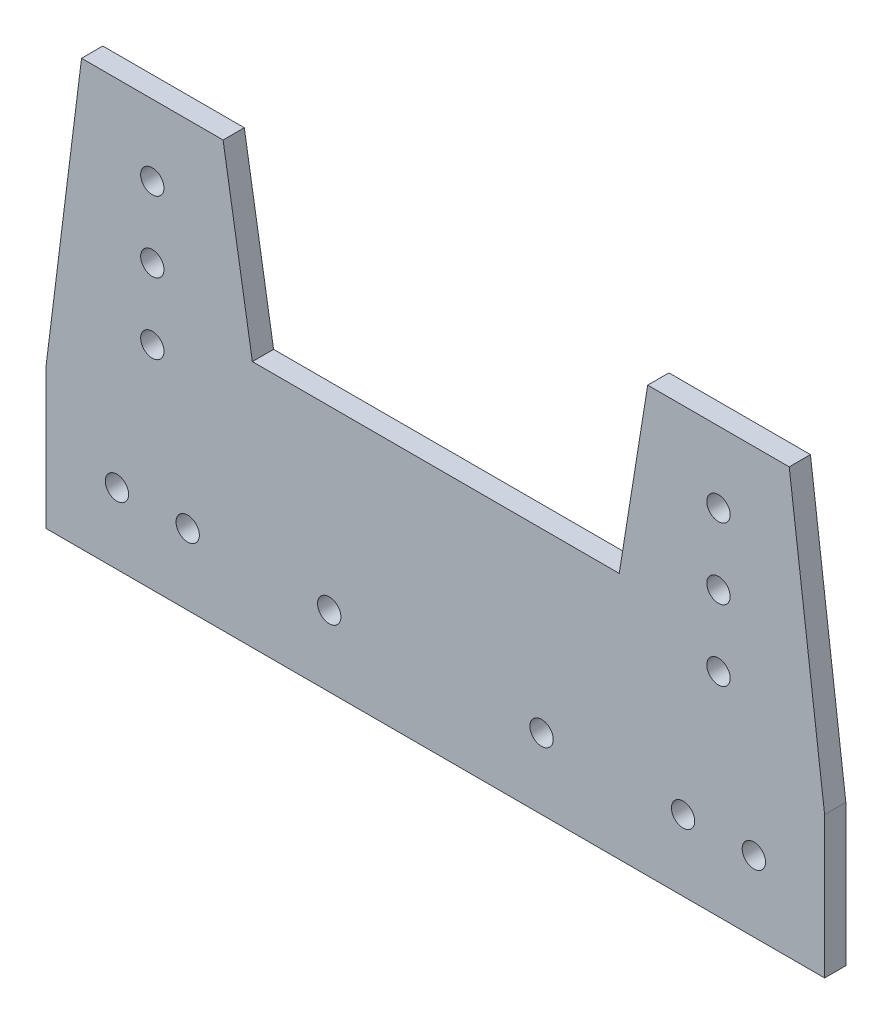
ISO-10303-21;
HEADER;
FILE_DESCRIPTION(('STEP AP214'),'2;1');
FILE_NAME('part.step','',(''),(''),'','','');
FILE_SCHEMA(('AUTOMOTIVE_DESIGN { 1 0 10303 214 1 1 1 1 }'));
ENDSEC;
DATA;
#1=APPLICATION_CONTEXT('core data for automotive mechanical design processes');
#2=APPLICATION_PROTOCOL_DEFINITION('international standard','automotive_design',2000,#1);
#3=PRODUCT_CONTEXT('',#1,'mechanical');
#4=PRODUCT('Part','Part','',(#3));
#5=PRODUCT_RELATED_PRODUCT_CATEGORY('part','',(#4));
#6=PRODUCT_DEFINITION_FORMATION('','',#4);
#7=PRODUCT_DEFINITION_CONTEXT('part definition',#1,'design');
#8=PRODUCT_DEFINITION('design','',#6,#7);
#9=PRODUCT_DEFINITION_SHAPE('','',#8);
#10=(LENGTH_UNIT() NAMED_UNIT(*) SI_UNIT(.MILLI.,.METRE.));
#11=(NAMED_UNIT(*) PLANE_ANGLE_UNIT() SI_UNIT($,.RADIAN.));
#12=(NAMED_UNIT(*) SI_UNIT($,.STERADIAN.) SOLID_ANGLE_UNIT());
#13=UNCERTAINTY_MEASURE_WITH_UNIT(LENGTH_MEASURE(1.E-05),#10,'distance_accuracy_value','');
#14=(GEOMETRIC_REPRESENTATION_CONTEXT(3) GLOBAL_UNCERTAINTY_ASSIGNED_CONTEXT((#13)) GLOBAL_UNIT_ASSIGNED_CONTEXT((#10,
#11,#12)) REPRESENTATION_CONTEXT('',''));
#15=CARTESIAN_POINT('',(0.,0.,0.));
#16=DIRECTION('',(0.,0.,1.));
#17=DIRECTION('',(1.,0.,0.));
#18=AXIS2_PLACEMENT_3D('',#15,#16,#17);
#19=CARTESIAN_POINT('',(0.,0.,3.));
#20=DIRECTION('',(0.,0.,1.));
#21=DIRECTION('',(1.,0.,0.));
#22=AXIS2_PLACEMENT_3D('',#19,#20,#21);
#23=PLANE('',#22);
#24=CARTESIAN_POINT('',(-40.,40.,3.));
#25=DIRECTION('',(0.,0.,1.));
#26=DIRECTION('',(1.,0.,0.));
#27=AXIS2_PLACEMENT_3D('',#24,#25,#26);
#28=CIRCLE('',#27,1.65);
#29=CARTESIAN_POINT('',(-38.35,40.,3.));
#30=VERTEX_POINT('',#29);
#31=EDGE_CURVE('E274',#30,#30,#28,.T.);
#32=ORIENTED_EDGE('',*,*,#31,.F.);
#33=EDGE_LOOP('',(#32));
#34=FACE_BOUND('',#33,.T.);
#35=CARTESIAN_POINT('',(-35.,0.,3.));
#36=DIRECTION('',(0.,0.,1.));
#37=DIRECTION('',(1.,0.,0.));
#38=AXIS2_PLACEMENT_3D('',#35,#36,#37);
#39=CIRCLE('',#38,1.65);
#40=CARTESIAN_POINT('',(-33.35,0.,3.));
#41=VERTEX_POINT('',#40);
#42=EDGE_CURVE('E262',#41,#41,#39,.T.);
#43=ORIENTED_EDGE('',*,*,#42,.F.);
#44=EDGE_LOOP('',(#43));
#45=FACE_BOUND('',#44,.T.);
#46=CARTESIAN_POINT('',(40.,20.,3.));
#47=DIRECTION('',(0.,0.,1.));
#48=DIRECTION('',(1.,0.,0.));
#49=AXIS2_PLACEMENT_3D('',#46,#47,#48);
#50=CIRCLE('',#49,1.65);
#51=CARTESIAN_POINT('',(41.65,20.,3.));
#52=VERTEX_POINT('',#51);
#53=EDGE_CURVE('E250',#52,#52,#50,.T.);
#54=ORIENTED_EDGE('',*,*,#53,.F.);
#55=EDGE_LOOP('',(#54));
#56=FACE_BOUND('',#55,.T.);
#57=CARTESIAN_POINT('',(-15.,0.,3.));
#58=DIRECTION('',(0.,0.,1.));
#59=DIRECTION('',(1.,0.,0.));
#60=AXIS2_PLACEMENT_3D('',#57,#58,#59);
#61=CIRCLE('',#60,1.65);
#62=CARTESIAN_POINT('',(-13.35,0.,3.));
#63=VERTEX_POINT('',#62);
#64=EDGE_CURVE('E238',#63,#63,#61,.T.);
#65=ORIENTED_EDGE('',*,*,#64,.F.);
#66=EDGE_LOOP('',(#65));
#67=FACE_BOUND('',#66,.T.);
#68=CARTESIAN_POINT('',(-40.,20.,3.));
#69=DIRECTION('',(0.,0.,1.));
#70=DIRECTION('',(1.,0.,0.));
#71=AXIS2_PLACEMENT_3D('',#68,#69,#70);
#72=CIRCLE('',#71,1.65);
#73=CARTESIAN_POINT('',(-38.35,20.,3.));
#74=VERTEX_POINT('',#73);
#75=EDGE_CURVE('E226',#74,#74,#72,.T.);
#76=ORIENTED_EDGE('',*,*,#75,.F.);
#77=EDGE_LOOP('',(#76));
#78=FACE_BOUND('',#77,.T.);
#79=CARTESIAN_POINT('',(45.,0.,3.));
#80=DIRECTION('',(0.,0.,1.));
#81=DIRECTION('',(1.,0.,0.));
#82=AXIS2_PLACEMENT_3D('',#79,#80,#81);
#83=CIRCLE('',#82,1.65);
#84=CARTESIAN_POINT('',(46.65,0.,3.));
#85=VERTEX_POINT('',#84);
#86=EDGE_CURVE('E154',#85,#85,#83,.T.);
#87=ORIENTED_EDGE('',*,*,#86,.F.);
#88=EDGE_LOOP('',(#87));
#89=FACE_BOUND('',#88,.T.);
#90=DIRECTION('',(0.,1.,0.));
#91=VECTOR('',#90,1.);
#92=CARTESIAN_POINT('',(55.,10.,3.));
#93=LINE('',#92,#91);
#94=CARTESIAN_POINT('',(55.0000000000004,-9.99999999999993,3.));
#95=VERTEX_POINT('',#94);
#96=CARTESIAN_POINT('',(55.,10.,3.));
#97=VERTEX_POINT('',#96);
#98=EDGE_CURVE('E169',#95,#97,#93,.T.);
#99=ORIENTED_EDGE('',*,*,#98,.T.);
#100=DIRECTION('',(-0.123873909162727,0.992297966655553,0.));
#101=VECTOR('',#100,1.);
#102=CARTESIAN_POINT('',(50.,50.0527428803437,3.));
#103=LINE('',#102,#101);
#104=CARTESIAN_POINT('',(50.,50.0527428803437,3.));
#105=VERTEX_POINT('',#104);
#106=EDGE_CURVE('E107',#97,#105,#103,.T.);
#107=ORIENTED_EDGE('',*,*,#106,.T.);
#108=DIRECTION('',(-1.,0.,0.));
#109=VECTOR('',#108,1.);
#110=CARTESIAN_POINT('',(30.,50.0527428803437,3.));
#111=LINE('',#110,#109);
#112=CARTESIAN_POINT('',(30.,50.0527428803437,3.));
#113=VERTEX_POINT('',#112);
#114=EDGE_CURVE('E190',#105,#113,#111,.T.);
#115=ORIENTED_EDGE('',*,*,#114,.T.);
#116=DIRECTION('',(-0.158461282121987,-0.987365191845579,0.));
#117=VECTOR('',#116,1.);
#118=CARTESIAN_POINT('',(30.,50.0527428803437,3.));
#119=LINE('',#118,#117);
#120=CARTESIAN_POINT('',(25.9793095905364,25.,3.));
#121=VERTEX_POINT('',#120);
#122=EDGE_CURVE('E209',#113,#121,#119,.T.);
#123=ORIENTED_EDGE('',*,*,#122,.T.);
#124=DIRECTION('',(-1.,0.,0.));
#125=VECTOR('',#124,1.);
#126=CARTESIAN_POINT('',(-25.8642326267696,25.,3.));
#127=LINE('',#126,#125);
#128=CARTESIAN_POINT('',(-25.8642326267696,25.,3.));
#129=VERTEX_POINT('',#128);
#130=EDGE_CURVE('E206',#121,#129,#127,.T.);
#131=ORIENTED_EDGE('',*,*,#130,.T.);
#132=DIRECTION('',(-0.162877944725253,0.986646225919948,0.));
#133=VECTOR('',#132,1.);
#134=CARTESIAN_POINT('',(-30.,50.0527428803437,3.));
#135=LINE('',#134,#133);
#136=CARTESIAN_POINT('',(-30.,50.0527428803437,3.));
#137=VERTEX_POINT('',#136);
#138=EDGE_CURVE('E208',#129,#137,#135,.T.);
#139=ORIENTED_EDGE('',*,*,#138,.T.);
#140=DIRECTION('',(-1.,0.,0.));
#141=VECTOR('',#140,1.);
#142=CARTESIAN_POINT('',(-50.,50.0527428803437,3.));
#143=LINE('',#142,#141);
#144=CARTESIAN_POINT('',(-50.,50.0527428803437,3.));
#145=VERTEX_POINT('',#144);
#146=EDGE_CURVE('E132',#137,#145,#143,.T.);
#147=ORIENTED_EDGE('',*,*,#146,.T.);
#148=DIRECTION('',(-0.123873909162727,-0.992297966655553,0.));
#149=VECTOR('',#148,1.);
#150=CARTESIAN_POINT('',(-50.,50.0527428803437,3.));
#151=LINE('',#150,#149);
#152=CARTESIAN_POINT('',(-55.,10.,3.));
#153=VERTEX_POINT('',#152);
#154=EDGE_CURVE('E126',#145,#153,#151,.T.);
#155=ORIENTED_EDGE('',*,*,#154,.T.);
#156=DIRECTION('',(0.,-1.,0.));
#157=VECTOR('',#156,1.);
#158=CARTESIAN_POINT('',(-55.,10.,3.));
#159=LINE('',#158,#157);
#160=CARTESIAN_POINT('',(-55.0000000000001,-10.,3.));
#161=VERTEX_POINT('',#160);
#162=EDGE_CURVE('E130',#153,#161,#159,.T.);
#163=ORIENTED_EDGE('',*,*,#162,.T.);
#164=DIRECTION('',(1.,0.,0.));
#165=VECTOR('',#164,1.);
#166=CARTESIAN_POINT('',(-55.0000000000001,-10.,3.));
#167=LINE('',#166,#165);
#168=EDGE_CURVE('E58',#161,#95,#167,.T.);
#169=ORIENTED_EDGE('',*,*,#168,.T.);
#170=EDGE_LOOP('',(#99,#107,#115,#123,#131,#139,#147,#155,#163,#169));
#171=FACE_BOUND('',#170,.T.);
#172=CARTESIAN_POINT('',(-45.,0.,3.));
#173=DIRECTION('',(0.,0.,1.));
#174=DIRECTION('',(1.,0.,0.));
#175=AXIS2_PLACEMENT_3D('',#172,#173,#174);
#176=CIRCLE('',#175,1.65);
#177=CARTESIAN_POINT('',(-43.35,0.,3.));
#178=VERTEX_POINT('',#177);
#179=EDGE_CURVE('E220',#178,#178,#176,.T.);
#180=ORIENTED_EDGE('',*,*,#179,.F.);
#181=EDGE_LOOP('',(#180));
#182=FACE_BOUND('',#181,.T.);
#183=CARTESIAN_POINT('',(15.,0.,3.));
#184=DIRECTION('',(0.,0.,1.));
#185=DIRECTION('',(1.,0.,0.));
#186=AXIS2_PLACEMENT_3D('',#183,#184,#185);
#187=CIRCLE('',#186,1.65);
#188=CARTESIAN_POINT('',(16.65,0.,3.));
#189=VERTEX_POINT('',#188);
#190=EDGE_CURVE('E232',#189,#189,#187,.T.);
#191=ORIENTED_EDGE('',*,*,#190,.F.);
#192=EDGE_LOOP('',(#191));
#193=FACE_BOUND('',#192,.T.);
#194=CARTESIAN_POINT('',(-40.,30.,3.));
#195=DIRECTION('',(0.,0.,1.));
#196=DIRECTION('',(1.,0.,0.));
#197=AXIS2_PLACEMENT_3D('',#194,#195,#196);
#198=CIRCLE('',#197,1.65);
#199=CARTESIAN_POINT('',(-38.35,30.,3.));
#200=VERTEX_POINT('',#199);
#201=EDGE_CURVE('E244',#200,#200,#198,.T.);
#202=ORIENTED_EDGE('',*,*,#201,.F.);
#203=EDGE_LOOP('',(#202));
#204=FACE_BOUND('',#203,.T.);
#205=CARTESIAN_POINT('',(35.,0.,3.));
#206=DIRECTION('',(0.,0.,1.));
#207=DIRECTION('',(1.,0.,0.));
#208=AXIS2_PLACEMENT_3D('',#205,#206,#207);
#209=CIRCLE('',#208,1.65);
#210=CARTESIAN_POINT('',(36.65,0.,3.));
#211=VERTEX_POINT('',#210);
#212=EDGE_CURVE('E256',#211,#211,#209,.T.);
#213=ORIENTED_EDGE('',*,*,#212,.F.);
#214=EDGE_LOOP('',(#213));
#215=FACE_BOUND('',#214,.T.);
#216=CARTESIAN_POINT('',(40.,30.,3.));
#217=DIRECTION('',(0.,0.,1.));
#218=DIRECTION('',(1.,0.,0.));
#219=AXIS2_PLACEMENT_3D('',#216,#217,#218);
#220=CIRCLE('',#219,1.65);
#221=CARTESIAN_POINT('',(41.65,30.,3.));
#222=VERTEX_POINT('',#221);
#223=EDGE_CURVE('E268',#222,#222,#220,.T.);
#224=ORIENTED_EDGE('',*,*,#223,.F.);
#225=EDGE_LOOP('',(#224));
#226=FACE_BOUND('',#225,.T.);
#227=CARTESIAN_POINT('',(40.,40.,3.));
#228=DIRECTION('',(0.,0.,1.));
#229=DIRECTION('',(1.,0.,0.));
#230=AXIS2_PLACEMENT_3D('',#227,#228,#229);
#231=CIRCLE('',#230,1.65);
#232=CARTESIAN_POINT('',(41.65,40.,3.));
#233=VERTEX_POINT('',#232);
#234=EDGE_CURVE('E280',#233,#233,#231,.T.);
#235=ORIENTED_EDGE('',*,*,#234,.F.);
#236=EDGE_LOOP('',(#235));
#237=FACE_BOUND('',#236,.T.);
#238=ADVANCED_FACE('F41',(#34,#45,#56,#67,#78,#89,#171,#182,#193,#204,#215,#226,#237),#23,.T.);
#239=CARTESIAN_POINT('',(0.,0.,0.));
#240=DIRECTION('',(0.,0.,1.));
#241=DIRECTION('',(1.,0.,0.));
#242=AXIS2_PLACEMENT_3D('',#239,#240,#241);
#243=PLANE('',#242);
#244=DIRECTION('',(0.,1.,0.));
#245=VECTOR('',#244,1.);
#246=CARTESIAN_POINT('',(55.,10.,0.));
#247=LINE('',#246,#245);
#248=CARTESIAN_POINT('',(55.0000000000004,-9.99999999999993,0.));
#249=VERTEX_POINT('',#248);
#250=CARTESIAN_POINT('',(55.,10.,0.));
#251=VERTEX_POINT('',#250);
#252=EDGE_CURVE('E150',#249,#251,#247,.T.);
#253=ORIENTED_EDGE('',*,*,#252,.F.);
#254=DIRECTION('',(1.,0.,0.));
#255=VECTOR('',#254,1.);
#256=CARTESIAN_POINT('',(-55.0000000000001,-10.,0.));
#257=LINE('',#256,#255);
#258=CARTESIAN_POINT('',(-55.0000000000001,-10.,0.));
#259=VERTEX_POINT('',#258);
#260=EDGE_CURVE('E99',#259,#249,#257,.T.);
#261=ORIENTED_EDGE('',*,*,#260,.F.);
#262=DIRECTION('',(0.,-1.,0.));
#263=VECTOR('',#262,1.);
#264=CARTESIAN_POINT('',(-55.,10.,0.));
#265=LINE('',#264,#263);
#266=CARTESIAN_POINT('',(-55.,10.,0.));
#267=VERTEX_POINT('',#266);
#268=EDGE_CURVE('E93',#267,#259,#265,.T.);
#269=ORIENTED_EDGE('',*,*,#268,.F.);
#270=DIRECTION('',(-0.123873909162727,-0.992297966655553,0.));
#271=VECTOR('',#270,1.);
#272=CARTESIAN_POINT('',(-50.,50.0527428803437,0.));
#273=LINE('',#272,#271);
#274=CARTESIAN_POINT('',(-50.,50.0527428803437,0.));
#275=VERTEX_POINT('',#274);
#276=EDGE_CURVE('E140',#275,#267,#273,.T.);
#277=ORIENTED_EDGE('',*,*,#276,.F.);
#278=DIRECTION('',(-1.,0.,0.));
#279=VECTOR('',#278,1.);
#280=CARTESIAN_POINT('',(-50.,50.0527428803437,0.));
#281=LINE('',#280,#279);
#282=CARTESIAN_POINT('',(-30.,50.0527428803437,0.));
#283=VERTEX_POINT('',#282);
#284=EDGE_CURVE('E164',#283,#275,#281,.T.);
#285=ORIENTED_EDGE('',*,*,#284,.F.);
#286=DIRECTION('',(-0.162877944725253,0.986646225919948,0.));
#287=VECTOR('',#286,1.);
#288=CARTESIAN_POINT('',(-30.,50.0527428803437,0.));
#289=LINE('',#288,#287);
#290=CARTESIAN_POINT('',(-25.8642326267696,25.,0.));
#291=VERTEX_POINT('',#290);
#292=EDGE_CURVE('E162',#291,#283,#289,.T.);
#293=ORIENTED_EDGE('',*,*,#292,.F.);
#294=DIRECTION('',(-1.,0.,0.));
#295=VECTOR('',#294,1.);
#296=CARTESIAN_POINT('',(-25.8642326267696,25.,0.));
#297=LINE('',#296,#295);
#298=CARTESIAN_POINT('',(25.9793095905364,25.,0.));
#299=VERTEX_POINT('',#298);
#300=EDGE_CURVE('E160',#299,#291,#297,.T.);
#301=ORIENTED_EDGE('',*,*,#300,.F.);
#302=DIRECTION('',(-0.158461282121987,-0.987365191845579,0.));
#303=VECTOR('',#302,1.);
#304=CARTESIAN_POINT('',(30.,50.0527428803437,0.));
#305=LINE('',#304,#303);
#306=CARTESIAN_POINT('',(30.,50.0527428803437,0.));
#307=VERTEX_POINT('',#306);
#308=EDGE_CURVE('E158',#307,#299,#305,.T.);
#309=ORIENTED_EDGE('',*,*,#308,.F.);
#310=DIRECTION('',(-1.,0.,0.));
#311=VECTOR('',#310,1.);
#312=CARTESIAN_POINT('',(30.,50.0527428803437,0.));
#313=LINE('',#312,#311);
#314=CARTESIAN_POINT('',(50.,50.0527428803437,0.));
#315=VERTEX_POINT('',#314);
#316=EDGE_CURVE('E156',#315,#307,#313,.T.);
#317=ORIENTED_EDGE('',*,*,#316,.F.);
#318=DIRECTION('',(-0.123873909162727,0.992297966655553,0.));
#319=VECTOR('',#318,1.);
#320=CARTESIAN_POINT('',(50.,50.0527428803437,0.));
#321=LINE('',#320,#319);
#322=EDGE_CURVE('E153',#251,#315,#321,.T.);
#323=ORIENTED_EDGE('',*,*,#322,.F.);
#324=EDGE_LOOP('',(#253,#261,#269,#277,#285,#293,#301,#309,#317,#323));
#325=FACE_BOUND('',#324,.T.);
#326=CARTESIAN_POINT('',(45.,0.,0.));
#327=DIRECTION('',(0.,0.,1.));
#328=DIRECTION('',(1.,0.,0.));
#329=AXIS2_PLACEMENT_3D('',#326,#327,#328);
#330=CIRCLE('',#329,1.65);
#331=CARTESIAN_POINT('',(46.65,0.,0.));
#332=VERTEX_POINT('',#331);
#333=EDGE_CURVE('E217',#332,#332,#330,.T.);
#334=ORIENTED_EDGE('',*,*,#333,.T.);
#335=EDGE_LOOP('',(#334));
#336=FACE_BOUND('',#335,.T.);
#337=CARTESIAN_POINT('',(-45.,0.,0.));
#338=DIRECTION('',(0.,0.,1.));
#339=DIRECTION('',(1.,0.,0.));
#340=AXIS2_PLACEMENT_3D('',#337,#338,#339);
#341=CIRCLE('',#340,1.65);
#342=CARTESIAN_POINT('',(-43.35,0.,0.));
#343=VERTEX_POINT('',#342);
#344=EDGE_CURVE('E223',#343,#343,#341,.T.);
#345=ORIENTED_EDGE('',*,*,#344,.T.);
#346=EDGE_LOOP('',(#345));
#347=FACE_BOUND('',#346,.T.);
#348=CARTESIAN_POINT('',(-40.,20.,0.));
#349=DIRECTION('',(0.,0.,1.));
#350=DIRECTION('',(1.,0.,0.));
#351=AXIS2_PLACEMENT_3D('',#348,#349,#350);
#352=CIRCLE('',#351,1.65);
#353=CARTESIAN_POINT('',(-38.35,20.,0.));
#354=VERTEX_POINT('',#353);
#355=EDGE_CURVE('E229',#354,#354,#352,.T.);
#356=ORIENTED_EDGE('',*,*,#355,.T.);
#357=EDGE_LOOP('',(#356));
#358=FACE_BOUND('',#357,.T.);
#359=CARTESIAN_POINT('',(15.,0.,0.));
#360=DIRECTION('',(0.,0.,1.));
#361=DIRECTION('',(1.,0.,0.));
#362=AXIS2_PLACEMENT_3D('',#359,#360,#361);
#363=CIRCLE('',#362,1.65);
#364=CARTESIAN_POINT('',(16.65,0.,0.));
#365=VERTEX_POINT('',#364);
#366=EDGE_CURVE('E235',#365,#365,#363,.T.);
#367=ORIENTED_EDGE('',*,*,#366,.T.);
#368=EDGE_LOOP('',(#367));
#369=FACE_BOUND('',#368,.T.);
#370=CARTESIAN_POINT('',(-15.,0.,0.));
#371=DIRECTION('',(0.,0.,1.));
#372=DIRECTION('',(1.,0.,0.));
#373=AXIS2_PLACEMENT_3D('',#370,#371,#372);
#374=CIRCLE('',#373,1.65);
#375=CARTESIAN_POINT('',(-13.35,0.,0.));
#376=VERTEX_POINT('',#375);
#377=EDGE_CURVE('E241',#376,#376,#374,.T.);
#378=ORIENTED_EDGE('',*,*,#377,.T.);
#379=EDGE_LOOP('',(#378));
#380=FACE_BOUND('',#379,.T.);
#381=CARTESIAN_POINT('',(-40.,30.,0.));
#382=DIRECTION('',(0.,0.,1.));
#383=DIRECTION('',(1.,0.,0.));
#384=AXIS2_PLACEMENT_3D('',#381,#382,#383);
#385=CIRCLE('',#384,1.65);
#386=CARTESIAN_POINT('',(-38.35,30.,0.));
#387=VERTEX_POINT('',#386);
#388=EDGE_CURVE('E247',#387,#387,#385,.T.);
#389=ORIENTED_EDGE('',*,*,#388,.T.);
#390=EDGE_LOOP('',(#389));
#391=FACE_BOUND('',#390,.T.);
#392=CARTESIAN_POINT('',(40.,20.,0.));
#393=DIRECTION('',(0.,0.,1.));
#394=DIRECTION('',(1.,0.,0.));
#395=AXIS2_PLACEMENT_3D('',#392,#393,#394);
#396=CIRCLE('',#395,1.65);
#397=CARTESIAN_POINT('',(41.65,20.,0.));
#398=VERTEX_POINT('',#397);
#399=EDGE_CURVE('E253',#398,#398,#396,.T.);
#400=ORIENTED_EDGE('',*,*,#399,.T.);
#401=EDGE_LOOP('',(#400));
#402=FACE_BOUND('',#401,.T.);
#403=CARTESIAN_POINT('',(35.,0.,0.));
#404=DIRECTION('',(0.,0.,1.));
#405=DIRECTION('',(1.,0.,0.));
#406=AXIS2_PLACEMENT_3D('',#403,#404,#405);
#407=CIRCLE('',#406,1.65);
#408=CARTESIAN_POINT('',(36.65,0.,0.));
#409=VERTEX_POINT('',#408);
#410=EDGE_CURVE('E259',#409,#409,#407,.T.);
#411=ORIENTED_EDGE('',*,*,#410,.T.);
#412=EDGE_LOOP('',(#411));
#413=FACE_BOUND('',#412,.T.);
#414=CARTESIAN_POINT('',(-35.,0.,0.));
#415=DIRECTION('',(0.,0.,1.));
#416=DIRECTION('',(1.,0.,0.));
#417=AXIS2_PLACEMENT_3D('',#414,#415,#416);
#418=CIRCLE('',#417,1.65);
#419=CARTESIAN_POINT('',(-33.35,0.,0.));
#420=VERTEX_POINT('',#419);
#421=EDGE_CURVE('E265',#420,#420,#418,.T.);
#422=ORIENTED_EDGE('',*,*,#421,.T.);
#423=EDGE_LOOP('',(#422));
#424=FACE_BOUND('',#423,.T.);
#425=CARTESIAN_POINT('',(40.,30.,0.));
#426=DIRECTION('',(0.,0.,1.));
#427=DIRECTION('',(1.,0.,0.));
#428=AXIS2_PLACEMENT_3D('',#425,#426,#427);
#429=CIRCLE('',#428,1.65);
#430=CARTESIAN_POINT('',(41.65,30.,0.));
#431=VERTEX_POINT('',#430);
#432=EDGE_CURVE('E271',#431,#431,#429,.T.);
#433=ORIENTED_EDGE('',*,*,#432,.T.);
#434=EDGE_LOOP('',(#433));
#435=FACE_BOUND('',#434,.T.);
#436=CARTESIAN_POINT('',(-40.,40.,0.));
#437=DIRECTION('',(0.,0.,1.));
#438=DIRECTION('',(1.,0.,0.));
#439=AXIS2_PLACEMENT_3D('',#436,#437,#438);
#440=CIRCLE('',#439,1.65);
#441=CARTESIAN_POINT('',(-38.35,40.,0.));
#442=VERTEX_POINT('',#441);
#443=EDGE_CURVE('E277',#442,#442,#440,.T.);
#444=ORIENTED_EDGE('',*,*,#443,.T.);
#445=EDGE_LOOP('',(#444));
#446=FACE_BOUND('',#445,.T.);
#447=CARTESIAN_POINT('',(40.,40.,0.));
#448=DIRECTION('',(0.,0.,1.));
#449=DIRECTION('',(1.,0.,0.));
#450=AXIS2_PLACEMENT_3D('',#447,#448,#449);
#451=CIRCLE('',#450,1.65);
#452=CARTESIAN_POINT('',(41.65,40.,0.));
#453=VERTEX_POINT('',#452);
#454=EDGE_CURVE('E283',#453,#453,#451,.T.);
#455=ORIENTED_EDGE('',*,*,#454,.T.);
#456=EDGE_LOOP('',(#455));
#457=FACE_BOUND('',#456,.T.);
#458=ADVANCED_FACE('F194',(#325,#336,#347,#358,#369,#380,#391,#402,#413,#424,#435,#446,#457),
#243,.F.);
#459=CARTESIAN_POINT('',(55.,10.,3.));
#460=DIRECTION('',(-1.,0.,0.));
#461=DIRECTION('',(0.,-1.,0.));
#462=AXIS2_PLACEMENT_3D('',#459,#460,#461);
#463=PLANE('',#462);
#464=ORIENTED_EDGE('',*,*,#252,.T.);
#465=DIRECTION('',(0.,0.,-1.));
#466=VECTOR('',#465,1.);
#467=CARTESIAN_POINT('',(55.,10.,3.));
#468=LINE('',#467,#466);
#469=EDGE_CURVE('E11',#97,#251,#468,.T.);
#470=ORIENTED_EDGE('',*,*,#469,.F.);
#471=ORIENTED_EDGE('',*,*,#98,.F.);
#472=DIRECTION('',(0.,0.,-1.));
#473=VECTOR('',#472,1.);
#474=CARTESIAN_POINT('',(55.0000000000004,-9.99999999999993,3.));
#475=LINE('',#474,#473);
#476=EDGE_CURVE('E146',#95,#249,#475,.T.);
#477=ORIENTED_EDGE('',*,*,#476,.T.);
#478=EDGE_LOOP('',(#464,#470,#471,#477));
#479=FACE_BOUND('',#478,.T.);
#480=ADVANCED_FACE('F43',(#479),#463,.F.);
#481=CARTESIAN_POINT('',(50.,50.0527428803437,3.));
#482=DIRECTION('',(-0.992297966655553,-0.123873909162727,0.));
#483=DIRECTION('',(0.123873909162727,-0.992297966655553,0.));
#484=AXIS2_PLACEMENT_3D('',#481,#482,#483);
#485=PLANE('',#484);
#486=ORIENTED_EDGE('',*,*,#322,.T.);
#487=DIRECTION('',(0.,0.,-1.));
#488=VECTOR('',#487,1.);
#489=CARTESIAN_POINT('',(50.,50.0527428803437,3.));
#490=LINE('',#489,#488);
#491=EDGE_CURVE('E50',#105,#315,#490,.T.);
#492=ORIENTED_EDGE('',*,*,#491,.F.);
#493=ORIENTED_EDGE('',*,*,#106,.F.);
#494=ORIENTED_EDGE('',*,*,#469,.T.);
#495=EDGE_LOOP('',(#486,#492,#493,#494));
#496=FACE_BOUND('',#495,.T.);
#497=ADVANCED_FACE('F325',(#496),#485,.F.);
#498=CARTESIAN_POINT('',(30.,50.0527428803437,3.));
#499=DIRECTION('',(0.,-1.,0.));
#500=DIRECTION('',(1.,0.,0.));
#501=AXIS2_PLACEMENT_3D('',#498,#499,#500);
#502=PLANE('',#501);
#503=ORIENTED_EDGE('',*,*,#316,.T.);
#504=DIRECTION('',(0.,0.,-1.));
#505=VECTOR('',#504,1.);
#506=CARTESIAN_POINT('',(30.,50.0527428803437,3.));
#507=LINE('',#506,#505);
#508=EDGE_CURVE('E182',#113,#307,#507,.T.);
#509=ORIENTED_EDGE('',*,*,#508,.F.);
#510=ORIENTED_EDGE('',*,*,#114,.F.);
#511=ORIENTED_EDGE('',*,*,#491,.T.);
#512=EDGE_LOOP('',(#503,#509,#510,#511));
#513=FACE_BOUND('',#512,.T.);
#514=ADVANCED_FACE('F188',(#513),#502,.F.);
#515=CARTESIAN_POINT('',(30.,50.0527428803437,3.));
#516=DIRECTION('',(0.987365191845578,-0.158461282121987,0.));
#517=DIRECTION('',(0.158461282121987,0.987365191845579,0.));
#518=AXIS2_PLACEMENT_3D('',#515,#516,#517);
#519=PLANE('',#518);
#520=ORIENTED_EDGE('',*,*,#308,.T.);
#521=DIRECTION('',(0.,0.,-1.));
#522=VECTOR('',#521,1.);
#523=CARTESIAN_POINT('',(25.9793095905364,25.,3.));
#524=LINE('',#523,#522);
#525=EDGE_CURVE('E179',#121,#299,#524,.T.);
#526=ORIENTED_EDGE('',*,*,#525,.F.);
#527=ORIENTED_EDGE('',*,*,#122,.F.);
#528=ORIENTED_EDGE('',*,*,#508,.T.);
#529=EDGE_LOOP('',(#520,#526,#527,#528));
#530=FACE_BOUND('',#529,.T.);
#531=ADVANCED_FACE('F200',(#530),#519,.F.);
#532=CARTESIAN_POINT('',(-25.8642326267696,25.,3.));
#533=DIRECTION('',(0.,-1.,0.));
#534=DIRECTION('',(0.,0.,-1.));
#535=AXIS2_PLACEMENT_3D('',#532,#533,#534);
#536=PLANE('',#535);
#537=ORIENTED_EDGE('',*,*,#300,.T.);
#538=DIRECTION('',(0.,0.,-1.));
#539=VECTOR('',#538,1.);
#540=CARTESIAN_POINT('',(-25.8642326267696,25.,3.));
#541=LINE('',#540,#539);
#542=EDGE_CURVE('E176',#129,#291,#541,.T.);
#543=ORIENTED_EDGE('',*,*,#542,.F.);
#544=ORIENTED_EDGE('',*,*,#130,.F.);
#545=ORIENTED_EDGE('',*,*,#525,.T.);
#546=EDGE_LOOP('',(#537,#543,#544,#545));
#547=FACE_BOUND('',#546,.T.);
#548=ADVANCED_FACE('F204',(#547),#536,.F.);
#549=CARTESIAN_POINT('',(-30.,50.0527428803437,3.));
#550=DIRECTION('',(-0.986646225919948,-0.162877944725253,0.));
#551=DIRECTION('',(0.162877944725253,-0.986646225919948,0.));
#552=AXIS2_PLACEMENT_3D('',#549,#550,#551);
#553=PLANE('',#552);
#554=ORIENTED_EDGE('',*,*,#292,.T.);
#555=DIRECTION('',(0.,0.,-1.));
#556=VECTOR('',#555,1.);
#557=CARTESIAN_POINT('',(-30.,50.0527428803437,3.));
#558=LINE('',#557,#556);
#559=EDGE_CURVE('E173',#137,#283,#558,.T.);
#560=ORIENTED_EDGE('',*,*,#559,.F.);
#561=ORIENTED_EDGE('',*,*,#138,.F.);
#562=ORIENTED_EDGE('',*,*,#542,.T.);
#563=EDGE_LOOP('',(#554,#560,#561,#562));
#564=FACE_BOUND('',#563,.T.);
#565=ADVANCED_FACE('F315',(#564),#553,.F.);
#566=CARTESIAN_POINT('',(-50.,50.0527428803437,3.));
#567=DIRECTION('',(0.,-1.,0.));
#568=DIRECTION('',(1.,0.,0.));
#569=AXIS2_PLACEMENT_3D('',#566,#567,#568);
#570=PLANE('',#569);
#571=ORIENTED_EDGE('',*,*,#284,.T.);
#572=DIRECTION('',(0.,0.,-1.));
#573=VECTOR('',#572,1.);
#574=CARTESIAN_POINT('',(-50.,50.0527428803437,3.));
#575=LINE('',#574,#573);
#576=EDGE_CURVE('E141',#145,#275,#575,.T.);
#577=ORIENTED_EDGE('',*,*,#576,.F.);
#578=ORIENTED_EDGE('',*,*,#146,.F.);
#579=ORIENTED_EDGE('',*,*,#559,.T.);
#580=EDGE_LOOP('',(#571,#577,#578,#579));
#581=FACE_BOUND('',#580,.T.);
#582=ADVANCED_FACE('F312',(#581),#570,.F.);
#583=CARTESIAN_POINT('',(-50.,50.0527428803437,3.));
#584=DIRECTION('',(0.992297966655553,-0.123873909162727,0.));
#585=DIRECTION('',(0.123873909162727,0.992297966655553,0.));
#586=AXIS2_PLACEMENT_3D('',#583,#584,#585);
#587=PLANE('',#586);
#588=ORIENTED_EDGE('',*,*,#276,.T.);
#589=DIRECTION('',(0.,0.,-1.));
#590=VECTOR('',#589,1.);
#591=CARTESIAN_POINT('',(-55.,10.,3.));
#592=LINE('',#591,#590);
#593=EDGE_CURVE('E137',#153,#267,#592,.T.);
#594=ORIENTED_EDGE('',*,*,#593,.F.);
#595=ORIENTED_EDGE('',*,*,#154,.F.);
#596=ORIENTED_EDGE('',*,*,#576,.T.);
#597=EDGE_LOOP('',(#588,#594,#595,#596));
#598=FACE_BOUND('',#597,.T.);
#599=ADVANCED_FACE('F138',(#598),#587,.F.);
#600=CARTESIAN_POINT('',(-55.,10.,3.));
#601=DIRECTION('',(1.,0.,0.));
#602=DIRECTION('',(0.,1.,0.));
#603=AXIS2_PLACEMENT_3D('',#600,#601,#602);
#604=PLANE('',#603);
#605=ORIENTED_EDGE('',*,*,#268,.T.);
#606=DIRECTION('',(0.,0.,-1.));
#607=VECTOR('',#606,1.);
#608=CARTESIAN_POINT('',(-55.0000000000001,-10.,3.));
#609=LINE('',#608,#607);
#610=EDGE_CURVE('E142',#161,#259,#609,.T.);
#611=ORIENTED_EDGE('',*,*,#610,.F.);
#612=ORIENTED_EDGE('',*,*,#162,.F.);
#613=ORIENTED_EDGE('',*,*,#593,.T.);
#614=EDGE_LOOP('',(#605,#611,#612,#613));
#615=FACE_BOUND('',#614,.T.);
#616=ADVANCED_FACE('F144',(#615),#604,.F.);
#617=CARTESIAN_POINT('',(-55.0000000000001,-10.,3.));
#618=DIRECTION('',(0.,1.,0.));
#619=DIRECTION('',(-1.,0.,0.));
#620=AXIS2_PLACEMENT_3D('',#617,#618,#619);
#621=PLANE('',#620);
#622=ORIENTED_EDGE('',*,*,#260,.T.);
#623=ORIENTED_EDGE('',*,*,#476,.F.);
#624=ORIENTED_EDGE('',*,*,#168,.F.);
#625=ORIENTED_EDGE('',*,*,#610,.T.);
#626=EDGE_LOOP('',(#622,#623,#624,#625));
#627=FACE_BOUND('',#626,.T.);
#628=ADVANCED_FACE('F305',(#627),#621,.F.);
#629=CARTESIAN_POINT('',(45.,0.,3.));
#630=DIRECTION('',(0.,0.,-1.));
#631=DIRECTION('',(-1.,0.,0.));
#632=AXIS2_PLACEMENT_3D('',#629,#630,#631);
#633=CYLINDRICAL_SURFACE('',#632,1.65);
#634=ORIENTED_EDGE('',*,*,#86,.T.);
#635=EDGE_LOOP('',(#634));
#636=FACE_BOUND('',#635,.T.);
#637=ORIENTED_EDGE('',*,*,#333,.F.);
#638=EDGE_LOOP('',(#637));
#639=FACE_BOUND('',#638,.T.);
#640=ADVANCED_FACE('F302',(#636,#639),#633,.F.);
#641=CARTESIAN_POINT('',(-45.,0.,3.));
#642=DIRECTION('',(0.,0.,-1.));
#643=DIRECTION('',(-1.,0.,0.));
#644=AXIS2_PLACEMENT_3D('',#641,#642,#643);
#645=CYLINDRICAL_SURFACE('',#644,1.65);
#646=ORIENTED_EDGE('',*,*,#179,.T.);
#647=EDGE_LOOP('',(#646));
#648=FACE_BOUND('',#647,.T.);
#649=ORIENTED_EDGE('',*,*,#344,.F.);
#650=EDGE_LOOP('',(#649));
#651=FACE_BOUND('',#650,.T.);
#652=ADVANCED_FACE('F400',(#648,#651),#645,.F.);
#653=CARTESIAN_POINT('',(-40.,20.,3.));
#654=DIRECTION('',(0.,0.,-1.));
#655=DIRECTION('',(-1.,0.,0.));
#656=AXIS2_PLACEMENT_3D('',#653,#654,#655);
#657=CYLINDRICAL_SURFACE('',#656,1.65);
#658=ORIENTED_EDGE('',*,*,#75,.T.);
#659=EDGE_LOOP('',(#658));
#660=FACE_BOUND('',#659,.T.);
#661=ORIENTED_EDGE('',*,*,#355,.F.);
#662=EDGE_LOOP('',(#661));
#663=FACE_BOUND('',#662,.T.);
#664=ADVANCED_FACE('F408',(#660,#663),#657,.F.);
#665=CARTESIAN_POINT('',(15.,0.,3.));
#666=DIRECTION('',(0.,0.,-1.));
#667=DIRECTION('',(-1.,0.,0.));
#668=AXIS2_PLACEMENT_3D('',#665,#666,#667);
#669=CYLINDRICAL_SURFACE('',#668,1.65);
#670=ORIENTED_EDGE('',*,*,#190,.T.);
#671=EDGE_LOOP('',(#670));
#672=FACE_BOUND('',#671,.T.);
#673=ORIENTED_EDGE('',*,*,#366,.F.);
#674=EDGE_LOOP('',(#673));
#675=FACE_BOUND('',#674,.T.);
#676=ADVANCED_FACE('F416',(#672,#675),#669,.F.);
#677=CARTESIAN_POINT('',(-15.,0.,3.));
#678=DIRECTION('',(0.,0.,-1.));
#679=DIRECTION('',(-1.,0.,0.));
#680=AXIS2_PLACEMENT_3D('',#677,#678,#679);
#681=CYLINDRICAL_SURFACE('',#680,1.65);
#682=ORIENTED_EDGE('',*,*,#64,.T.);
#683=EDGE_LOOP('',(#682));
#684=FACE_BOUND('',#683,.T.);
#685=ORIENTED_EDGE('',*,*,#377,.F.);
#686=EDGE_LOOP('',(#685));
#687=FACE_BOUND('',#686,.T.);
#688=ADVANCED_FACE('F425',(#684,#687),#681,.F.);
#689=CARTESIAN_POINT('',(-40.,30.,3.));
#690=DIRECTION('',(0.,0.,-1.));
#691=DIRECTION('',(-1.,0.,0.));
#692=AXIS2_PLACEMENT_3D('',#689,#690,#691);
#693=CYLINDRICAL_SURFACE('',#692,1.65);
#694=ORIENTED_EDGE('',*,*,#201,.T.);
#695=EDGE_LOOP('',(#694));
#696=FACE_BOUND('',#695,.T.);
#697=ORIENTED_EDGE('',*,*,#388,.F.);
#698=EDGE_LOOP('',(#697));
#699=FACE_BOUND('',#698,.T.);
#700=ADVANCED_FACE('F434',(#696,#699),#693,.F.);
#701=CARTESIAN_POINT('',(40.,20.,3.));
#702=DIRECTION('',(0.,0.,-1.));
#703=DIRECTION('',(-1.,0.,0.));
#704=AXIS2_PLACEMENT_3D('',#701,#702,#703);
#705=CYLINDRICAL_SURFACE('',#704,1.65);
#706=ORIENTED_EDGE('',*,*,#53,.T.);
#707=EDGE_LOOP('',(#706));
#708=FACE_BOUND('',#707,.T.);
#709=ORIENTED_EDGE('',*,*,#399,.F.);
#710=EDGE_LOOP('',(#709));
#711=FACE_BOUND('',#710,.T.);
#712=ADVANCED_FACE('F443',(#708,#711),#705,.F.);
#713=CARTESIAN_POINT('',(35.,0.,3.));
#714=DIRECTION('',(0.,0.,-1.));
#715=DIRECTION('',(-1.,0.,0.));
#716=AXIS2_PLACEMENT_3D('',#713,#714,#715);
#717=CYLINDRICAL_SURFACE('',#716,1.65);
#718=ORIENTED_EDGE('',*,*,#212,.T.);
#719=EDGE_LOOP('',(#718));
#720=FACE_BOUND('',#719,.T.);
#721=ORIENTED_EDGE('',*,*,#410,.F.);
#722=EDGE_LOOP('',(#721));
#723=FACE_BOUND('',#722,.T.);
#724=ADVANCED_FACE('F452',(#720,#723),#717,.F.);
#725=CARTESIAN_POINT('',(-35.,0.,3.));
#726=DIRECTION('',(0.,0.,-1.));
#727=DIRECTION('',(-1.,0.,0.));
#728=AXIS2_PLACEMENT_3D('',#725,#726,#727);
#729=CYLINDRICAL_SURFACE('',#728,1.65);
#730=ORIENTED_EDGE('',*,*,#42,.T.);
#731=EDGE_LOOP('',(#730));
#732=FACE_BOUND('',#731,.T.);
#733=ORIENTED_EDGE('',*,*,#421,.F.);
#734=EDGE_LOOP('',(#733));
#735=FACE_BOUND('',#734,.T.);
#736=ADVANCED_FACE('F461',(#732,#735),#729,.F.);
#737=CARTESIAN_POINT('',(40.,30.,3.));
#738=DIRECTION('',(0.,0.,-1.));
#739=DIRECTION('',(-1.,0.,0.));
#740=AXIS2_PLACEMENT_3D('',#737,#738,#739);
#741=CYLINDRICAL_SURFACE('',#740,1.65);
#742=ORIENTED_EDGE('',*,*,#223,.T.);
#743=EDGE_LOOP('',(#742));
#744=FACE_BOUND('',#743,.T.);
#745=ORIENTED_EDGE('',*,*,#432,.F.);
#746=EDGE_LOOP('',(#745));
#747=FACE_BOUND('',#746,.T.);
#748=ADVANCED_FACE('F470',(#744,#747),#741,.F.);
#749=CARTESIAN_POINT('',(-40.,40.,3.));
#750=DIRECTION('',(0.,0.,-1.));
#751=DIRECTION('',(-1.,0.,0.));
#752=AXIS2_PLACEMENT_3D('',#749,#750,#751);
#753=CYLINDRICAL_SURFACE('',#752,1.65);
#754=ORIENTED_EDGE('',*,*,#31,.T.);
#755=EDGE_LOOP('',(#754));
#756=FACE_BOUND('',#755,.T.);
#757=ORIENTED_EDGE('',*,*,#443,.F.);
#758=EDGE_LOOP('',(#757));
#759=FACE_BOUND('',#758,.T.);
#760=ADVANCED_FACE('F479',(#756,#759),#753,.F.);
#761=CARTESIAN_POINT('',(40.,40.,3.));
#762=DIRECTION('',(0.,0.,-1.));
#763=DIRECTION('',(-1.,0.,0.));
#764=AXIS2_PLACEMENT_3D('',#761,#762,#763);
#765=CYLINDRICAL_SURFACE('',#764,1.65);
#766=ORIENTED_EDGE('',*,*,#234,.T.);
#767=EDGE_LOOP('',(#766));
#768=FACE_BOUND('',#767,.T.);
#769=ORIENTED_EDGE('',*,*,#454,.F.);
#770=EDGE_LOOP('',(#769));
#771=FACE_BOUND('',#770,.T.);
#772=ADVANCED_FACE('F289',(#768,#771),#765,.F.);
#773=CLOSED_SHELL('',(#238,#458,#480,#497,#514,#531,#548,#565,#582,#599,#616,#628,#640,#652,
#664,#676,#688,#700,#712,#724,#736,#748,#760,#772));
#774=MANIFOLD_SOLID_BREP('B2',#773);
#775=ADVANCED_BREP_SHAPE_REPRESENTATION('',(#18,#774),#14);
#776=SHAPE_DEFINITION_REPRESENTATION(#9,#775);
ENDSEC;
END-ISO-10303-21;
